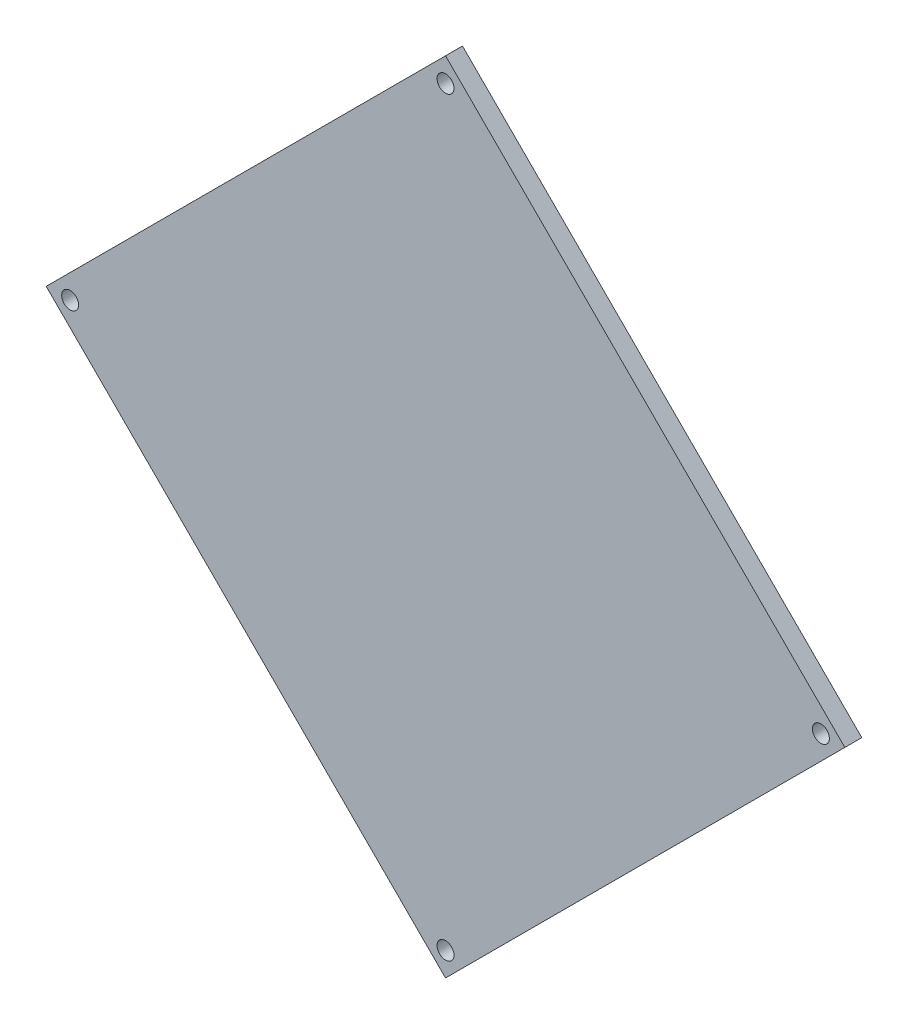
ISO-10303-21;
HEADER;
FILE_DESCRIPTION(('STEP AP214'),'2;1');
FILE_NAME('part.step','',(''),(''),'','','');
FILE_SCHEMA(('AUTOMOTIVE_DESIGN { 1 0 10303 214 1 1 1 1 }'));
ENDSEC;
DATA;
#1=APPLICATION_CONTEXT('core data for automotive mechanical design processes');
#2=APPLICATION_PROTOCOL_DEFINITION('international standard','automotive_design',2000,#1);
#3=PRODUCT_CONTEXT('',#1,'mechanical');
#4=PRODUCT('Part','Part','',(#3));
#5=PRODUCT_RELATED_PRODUCT_CATEGORY('part','',(#4));
#6=PRODUCT_DEFINITION_FORMATION('','',#4);
#7=PRODUCT_DEFINITION_CONTEXT('part definition',#1,'design');
#8=PRODUCT_DEFINITION('design','',#6,#7);
#9=PRODUCT_DEFINITION_SHAPE('','',#8);
#10=(LENGTH_UNIT() NAMED_UNIT(*) SI_UNIT(.MILLI.,.METRE.));
#11=(NAMED_UNIT(*) PLANE_ANGLE_UNIT() SI_UNIT($,.RADIAN.));
#12=(NAMED_UNIT(*) SI_UNIT($,.STERADIAN.) SOLID_ANGLE_UNIT());
#13=UNCERTAINTY_MEASURE_WITH_UNIT(LENGTH_MEASURE(1.E-05),#10,'distance_accuracy_value','');
#14=(GEOMETRIC_REPRESENTATION_CONTEXT(3) GLOBAL_UNCERTAINTY_ASSIGNED_CONTEXT((#13)) GLOBAL_UNIT_ASSIGNED_CONTEXT((#10,
#11,#12)) REPRESENTATION_CONTEXT('',''));
#15=CARTESIAN_POINT('',(0.,0.,0.));
#16=DIRECTION('',(0.,0.,1.));
#17=DIRECTION('',(1.,0.,0.));
#18=AXIS2_PLACEMENT_3D('',#15,#16,#17);
#19=CARTESIAN_POINT('',(0.,0.,3.));
#20=DIRECTION('',(0.,0.,1.));
#21=DIRECTION('',(1.,0.,0.));
#22=AXIS2_PLACEMENT_3D('',#19,#20,#21);
#23=PLANE('',#22);
#24=CARTESIAN_POINT('',(-4.64143824643468E-13,-66.4680374315358,3.));
#25=DIRECTION('',(0.,0.,1.));
#26=DIRECTION('',(1.,0.,0.));
#27=AXIS2_PLACEMENT_3D('',#24,#25,#26);
#28=CIRCLE('',#27,1.5);
#29=CARTESIAN_POINT('',(1.49999999999954,-66.4680374315358,3.));
#30=VERTEX_POINT('',#29);
#31=EDGE_CURVE('E131',#30,#30,#28,.T.);
#32=ORIENTED_EDGE('',*,*,#31,.F.);
#33=EDGE_LOOP('',(#32));
#34=FACE_BOUND('',#33,.T.);
#35=CARTESIAN_POINT('',(0.,66.4680374315358,3.));
#36=DIRECTION('',(0.,0.,1.));
#37=DIRECTION('',(1.,0.,0.));
#38=AXIS2_PLACEMENT_3D('',#35,#36,#37);
#39=CIRCLE('',#38,1.5);
#40=CARTESIAN_POINT('',(1.5,66.4680374315358,3.));
#41=VERTEX_POINT('',#40);
#42=EDGE_CURVE('E110',#41,#41,#39,.T.);
#43=ORIENTED_EDGE('',*,*,#42,.F.);
#44=EDGE_LOOP('',(#43));
#45=FACE_BOUND('',#44,.T.);
#46=DIRECTION('',(0.707106781186544,0.707106781186551,0.));
#47=VECTOR('',#46,1.);
#48=CARTESIAN_POINT('',(7.36325259043501E-13,-70.7106781186546,3.));
#49=LINE('',#48,#47);
#50=CARTESIAN_POINT('',(7.36325259043501E-13,-70.7106781186546,3.));
#51=VERTEX_POINT('',#50);
#52=CARTESIAN_POINT('',(70.7106781186546,0.,3.));
#53=VERTEX_POINT('',#52);
#54=EDGE_CURVE('E95',#51,#53,#49,.T.);
#55=ORIENTED_EDGE('',*,*,#54,.T.);
#56=DIRECTION('',(-0.707106781186549,0.707106781186546,0.));
#57=VECTOR('',#56,1.);
#58=CARTESIAN_POINT('',(70.7106781186546,0.,3.));
#59=LINE('',#58,#57);
#60=CARTESIAN_POINT('',(-2.42555232827049E-13,70.7106781186546,3.));
#61=VERTEX_POINT('',#60);
#62=EDGE_CURVE('E90',#53,#61,#59,.T.);
#63=ORIENTED_EDGE('',*,*,#62,.T.);
#64=DIRECTION('',(-0.707106781186544,-0.707106781186551,0.));
#65=VECTOR('',#64,1.);
#66=CARTESIAN_POINT('',(-2.42555232827049E-13,70.7106781186546,3.));
#67=LINE('',#66,#65);
#68=CARTESIAN_POINT('',(-70.7106781186546,-4.93770026216452E-13,3.));
#69=VERTEX_POINT('',#68);
#70=EDGE_CURVE('E93',#61,#69,#67,.T.);
#71=ORIENTED_EDGE('',*,*,#70,.T.);
#72=DIRECTION('',(0.707106781186554,-0.707106781186541,0.));
#73=VECTOR('',#72,1.);
#74=CARTESIAN_POINT('',(-70.7106781186546,-4.93770026216452E-13,3.));
#75=LINE('',#74,#73);
#76=EDGE_CURVE('E60',#69,#51,#75,.T.);
#77=ORIENTED_EDGE('',*,*,#76,.T.);
#78=EDGE_LOOP('',(#55,#63,#71,#77));
#79=FACE_BOUND('',#78,.T.);
#80=CARTESIAN_POINT('',(66.4680374315358,-2.32071912321734E-13,3.));
#81=DIRECTION('',(0.,0.,1.));
#82=DIRECTION('',(1.,0.,0.));
#83=AXIS2_PLACEMENT_3D('',#80,#81,#82);
#84=CIRCLE('',#83,1.5);
#85=CARTESIAN_POINT('',(67.9680374315358,-2.32071912321734E-13,3.));
#86=VERTEX_POINT('',#85);
#87=EDGE_CURVE('E125',#86,#86,#84,.T.);
#88=ORIENTED_EDGE('',*,*,#87,.F.);
#89=EDGE_LOOP('',(#88));
#90=FACE_BOUND('',#89,.T.);
#91=CARTESIAN_POINT('',(-66.4680374315358,6.96215736965202E-13,3.));
#92=DIRECTION('',(0.,0.,1.));
#93=DIRECTION('',(1.,0.,0.));
#94=AXIS2_PLACEMENT_3D('',#91,#92,#93);
#95=CIRCLE('',#94,1.5);
#96=CARTESIAN_POINT('',(-64.9680374315358,6.96215736965202E-13,3.));
#97=VERTEX_POINT('',#96);
#98=EDGE_CURVE('E137',#97,#97,#95,.T.);
#99=ORIENTED_EDGE('',*,*,#98,.F.);
#100=EDGE_LOOP('',(#99));
#101=FACE_BOUND('',#100,.T.);
#102=ADVANCED_FACE('F43',(#34,#45,#79,#90,#101),#23,.T.);
#103=CARTESIAN_POINT('',(0.,0.,0.));
#104=DIRECTION('',(0.,0.,1.));
#105=DIRECTION('',(1.,0.,0.));
#106=AXIS2_PLACEMENT_3D('',#103,#104,#105);
#107=PLANE('',#106);
#108=DIRECTION('',(0.707106781186544,0.707106781186551,0.));
#109=VECTOR('',#108,1.);
#110=CARTESIAN_POINT('',(7.36325259043501E-13,-70.7106781186546,0.));
#111=LINE('',#110,#109);
#112=CARTESIAN_POINT('',(7.36325259043501E-13,-70.7106781186546,0.));
#113=VERTEX_POINT('',#112);
#114=CARTESIAN_POINT('',(70.7106781186546,0.,0.));
#115=VERTEX_POINT('',#114);
#116=EDGE_CURVE('E107',#113,#115,#111,.T.);
#117=ORIENTED_EDGE('',*,*,#116,.F.);
#118=DIRECTION('',(0.707106781186554,-0.707106781186541,0.));
#119=VECTOR('',#118,1.);
#120=CARTESIAN_POINT('',(-70.7106781186546,-4.93770026216452E-13,0.));
#121=LINE('',#120,#119);
#122=CARTESIAN_POINT('',(-70.7106781186546,-4.93770026216452E-13,0.));
#123=VERTEX_POINT('',#122);
#124=EDGE_CURVE('E83',#123,#113,#121,.T.);
#125=ORIENTED_EDGE('',*,*,#124,.F.);
#126=DIRECTION('',(-0.707106781186544,-0.707106781186551,0.));
#127=VECTOR('',#126,1.);
#128=CARTESIAN_POINT('',(-2.42555232827049E-13,70.7106781186546,0.));
#129=LINE('',#128,#127);
#130=CARTESIAN_POINT('',(-2.42555232827049E-13,70.7106781186546,0.));
#131=VERTEX_POINT('',#130);
#132=EDGE_CURVE('E77',#131,#123,#129,.T.);
#133=ORIENTED_EDGE('',*,*,#132,.F.);
#134=DIRECTION('',(-0.707106781186549,0.707106781186546,0.));
#135=VECTOR('',#134,1.);
#136=CARTESIAN_POINT('',(70.7106781186546,0.,0.));
#137=LINE('',#136,#135);
#138=EDGE_CURVE('E99',#115,#131,#137,.T.);
#139=ORIENTED_EDGE('',*,*,#138,.F.);
#140=EDGE_LOOP('',(#117,#125,#133,#139));
#141=FACE_BOUND('',#140,.T.);
#142=CARTESIAN_POINT('',(0.,66.4680374315358,0.));
#143=DIRECTION('',(0.,0.,1.));
#144=DIRECTION('',(1.,0.,0.));
#145=AXIS2_PLACEMENT_3D('',#142,#143,#144);
#146=CIRCLE('',#145,1.5);
#147=CARTESIAN_POINT('',(1.5,66.4680374315358,0.));
#148=VERTEX_POINT('',#147);
#149=EDGE_CURVE('E122',#148,#148,#146,.T.);
#150=ORIENTED_EDGE('',*,*,#149,.T.);
#151=EDGE_LOOP('',(#150));
#152=FACE_BOUND('',#151,.T.);
#153=CARTESIAN_POINT('',(66.4680374315358,-2.32071912321734E-13,0.));
#154=DIRECTION('',(0.,0.,1.));
#155=DIRECTION('',(1.,0.,0.));
#156=AXIS2_PLACEMENT_3D('',#153,#154,#155);
#157=CIRCLE('',#156,1.5);
#158=CARTESIAN_POINT('',(67.9680374315358,-2.32071912321734E-13,0.));
#159=VERTEX_POINT('',#158);
#160=EDGE_CURVE('E128',#159,#159,#157,.T.);
#161=ORIENTED_EDGE('',*,*,#160,.T.);
#162=EDGE_LOOP('',(#161));
#163=FACE_BOUND('',#162,.T.);
#164=CARTESIAN_POINT('',(-4.64143824643468E-13,-66.4680374315358,0.));
#165=DIRECTION('',(0.,0.,1.));
#166=DIRECTION('',(1.,0.,0.));
#167=AXIS2_PLACEMENT_3D('',#164,#165,#166);
#168=CIRCLE('',#167,1.5);
#169=CARTESIAN_POINT('',(1.49999999999954,-66.4680374315358,0.));
#170=VERTEX_POINT('',#169);
#171=EDGE_CURVE('E134',#170,#170,#168,.T.);
#172=ORIENTED_EDGE('',*,*,#171,.T.);
#173=EDGE_LOOP('',(#172));
#174=FACE_BOUND('',#173,.T.);
#175=CARTESIAN_POINT('',(-66.4680374315358,6.96215736965202E-13,0.));
#176=DIRECTION('',(0.,0.,1.));
#177=DIRECTION('',(1.,0.,0.));
#178=AXIS2_PLACEMENT_3D('',#175,#176,#177);
#179=CIRCLE('',#178,1.5);
#180=CARTESIAN_POINT('',(-64.9680374315358,6.96215736965202E-13,0.));
#181=VERTEX_POINT('',#180);
#182=EDGE_CURVE('E140',#181,#181,#179,.T.);
#183=ORIENTED_EDGE('',*,*,#182,.T.);
#184=EDGE_LOOP('',(#183));
#185=FACE_BOUND('',#184,.T.);
#186=ADVANCED_FACE('F118',(#141,#152,#163,#174,#185),#107,.F.);
#187=CARTESIAN_POINT('',(7.36325259043501E-13,-70.7106781186546,3.));
#188=DIRECTION('',(-0.707106781186551,0.707106781186544,0.));
#189=DIRECTION('',(-0.707106781186544,-0.707106781186551,0.));
#190=AXIS2_PLACEMENT_3D('',#187,#188,#189);
#191=PLANE('',#190);
#192=ORIENTED_EDGE('',*,*,#116,.T.);
#193=DIRECTION('',(0.,0.,-1.));
#194=VECTOR('',#193,1.);
#195=CARTESIAN_POINT('',(70.7106781186546,0.,3.));
#196=LINE('',#195,#194);
#197=EDGE_CURVE('E11',#53,#115,#196,.T.);
#198=ORIENTED_EDGE('',*,*,#197,.F.);
#199=ORIENTED_EDGE('',*,*,#54,.F.);
#200=DIRECTION('',(0.,0.,-1.));
#201=VECTOR('',#200,1.);
#202=CARTESIAN_POINT('',(7.36325259043501E-13,-70.7106781186546,3.));
#203=LINE('',#202,#201);
#204=EDGE_CURVE('E103',#51,#113,#203,.T.);
#205=ORIENTED_EDGE('',*,*,#204,.T.);
#206=EDGE_LOOP('',(#192,#198,#199,#205));
#207=FACE_BOUND('',#206,.T.);
#208=ADVANCED_FACE('F45',(#207),#191,.F.);
#209=CARTESIAN_POINT('',(70.7106781186546,0.,3.));
#210=DIRECTION('',(-0.707106781186546,-0.707106781186549,0.));
#211=DIRECTION('',(0.707106781186549,-0.707106781186546,0.));
#212=AXIS2_PLACEMENT_3D('',#209,#210,#211);
#213=PLANE('',#212);
#214=ORIENTED_EDGE('',*,*,#138,.T.);
#215=DIRECTION('',(0.,0.,-1.));
#216=VECTOR('',#215,1.);
#217=CARTESIAN_POINT('',(-2.42555232827049E-13,70.7106781186546,3.));
#218=LINE('',#217,#216);
#219=EDGE_CURVE('E52',#61,#131,#218,.T.);
#220=ORIENTED_EDGE('',*,*,#219,.F.);
#221=ORIENTED_EDGE('',*,*,#62,.F.);
#222=ORIENTED_EDGE('',*,*,#197,.T.);
#223=EDGE_LOOP('',(#214,#220,#221,#222));
#224=FACE_BOUND('',#223,.T.);
#225=ADVANCED_FACE('F98',(#224),#213,.F.);
#226=CARTESIAN_POINT('',(-2.42555232827049E-13,70.7106781186546,3.));
#227=DIRECTION('',(0.707106781186551,-0.707106781186544,0.));
#228=DIRECTION('',(0.707106781186544,0.707106781186551,0.));
#229=AXIS2_PLACEMENT_3D('',#226,#227,#228);
#230=PLANE('',#229);
#231=ORIENTED_EDGE('',*,*,#132,.T.);
#232=DIRECTION('',(0.,0.,-1.));
#233=VECTOR('',#232,1.);
#234=CARTESIAN_POINT('',(-70.7106781186546,-4.93770026216452E-13,3.));
#235=LINE('',#234,#233);
#236=EDGE_CURVE('E100',#69,#123,#235,.T.);
#237=ORIENTED_EDGE('',*,*,#236,.F.);
#238=ORIENTED_EDGE('',*,*,#70,.F.);
#239=ORIENTED_EDGE('',*,*,#219,.T.);
#240=EDGE_LOOP('',(#231,#237,#238,#239));
#241=FACE_BOUND('',#240,.T.);
#242=ADVANCED_FACE('F101',(#241),#230,.F.);
#243=CARTESIAN_POINT('',(-70.7106781186546,-4.93770026216452E-13,3.));
#244=DIRECTION('',(0.707106781186541,0.707106781186554,0.));
#245=DIRECTION('',(-0.707106781186554,0.707106781186541,0.));
#246=AXIS2_PLACEMENT_3D('',#243,#244,#245);
#247=PLANE('',#246);
#248=ORIENTED_EDGE('',*,*,#124,.T.);
#249=ORIENTED_EDGE('',*,*,#204,.F.);
#250=ORIENTED_EDGE('',*,*,#76,.F.);
#251=ORIENTED_EDGE('',*,*,#236,.T.);
#252=EDGE_LOOP('',(#248,#249,#250,#251));
#253=FACE_BOUND('',#252,.T.);
#254=ADVANCED_FACE('F115',(#253),#247,.F.);
#255=CARTESIAN_POINT('',(0.,66.4680374315358,3.));
#256=DIRECTION('',(0.,0.,-1.));
#257=DIRECTION('',(-1.,0.,0.));
#258=AXIS2_PLACEMENT_3D('',#255,#256,#257);
#259=CYLINDRICAL_SURFACE('',#258,1.5);
#260=ORIENTED_EDGE('',*,*,#42,.T.);
#261=EDGE_LOOP('',(#260));
#262=FACE_BOUND('',#261,.T.);
#263=ORIENTED_EDGE('',*,*,#149,.F.);
#264=EDGE_LOOP('',(#263));
#265=FACE_BOUND('',#264,.T.);
#266=ADVANCED_FACE('F159',(#262,#265),#259,.F.);
#267=CARTESIAN_POINT('',(66.4680374315358,-2.32071912321734E-13,3.));
#268=DIRECTION('',(0.,0.,-1.));
#269=DIRECTION('',(-1.,0.,0.));
#270=AXIS2_PLACEMENT_3D('',#267,#268,#269);
#271=CYLINDRICAL_SURFACE('',#270,1.5);
#272=ORIENTED_EDGE('',*,*,#87,.T.);
#273=EDGE_LOOP('',(#272));
#274=FACE_BOUND('',#273,.T.);
#275=ORIENTED_EDGE('',*,*,#160,.F.);
#276=EDGE_LOOP('',(#275));
#277=FACE_BOUND('',#276,.T.);
#278=ADVANCED_FACE('F204',(#274,#277),#271,.F.);
#279=CARTESIAN_POINT('',(-4.64143824643468E-13,-66.4680374315358,3.));
#280=DIRECTION('',(0.,0.,-1.));
#281=DIRECTION('',(-1.,0.,0.));
#282=AXIS2_PLACEMENT_3D('',#279,#280,#281);
#283=CYLINDRICAL_SURFACE('',#282,1.5);
#284=ORIENTED_EDGE('',*,*,#31,.T.);
#285=EDGE_LOOP('',(#284));
#286=FACE_BOUND('',#285,.T.);
#287=ORIENTED_EDGE('',*,*,#171,.F.);
#288=EDGE_LOOP('',(#287));
#289=FACE_BOUND('',#288,.T.);
#290=ADVANCED_FACE('F212',(#286,#289),#283,.F.);
#291=CARTESIAN_POINT('',(-66.4680374315358,6.96215736965202E-13,3.));
#292=DIRECTION('',(0.,0.,-1.));
#293=DIRECTION('',(-1.,0.,0.));
#294=AXIS2_PLACEMENT_3D('',#291,#292,#293);
#295=CYLINDRICAL_SURFACE('',#294,1.5);
#296=ORIENTED_EDGE('',*,*,#98,.T.);
#297=EDGE_LOOP('',(#296));
#298=FACE_BOUND('',#297,.T.);
#299=ORIENTED_EDGE('',*,*,#182,.F.);
#300=EDGE_LOOP('',(#299));
#301=FACE_BOUND('',#300,.T.);
#302=ADVANCED_FACE('F146',(#298,#301),#295,.F.);
#303=CLOSED_SHELL('',(#102,#186,#208,#225,#242,#254,#266,#278,#290,#302));
#304=MANIFOLD_SOLID_BREP('B2',#303);
#305=ADVANCED_BREP_SHAPE_REPRESENTATION('',(#18,#304),#14);
#306=SHAPE_DEFINITION_REPRESENTATION(#9,#305);
ENDSEC;
END-ISO-10303-21;
